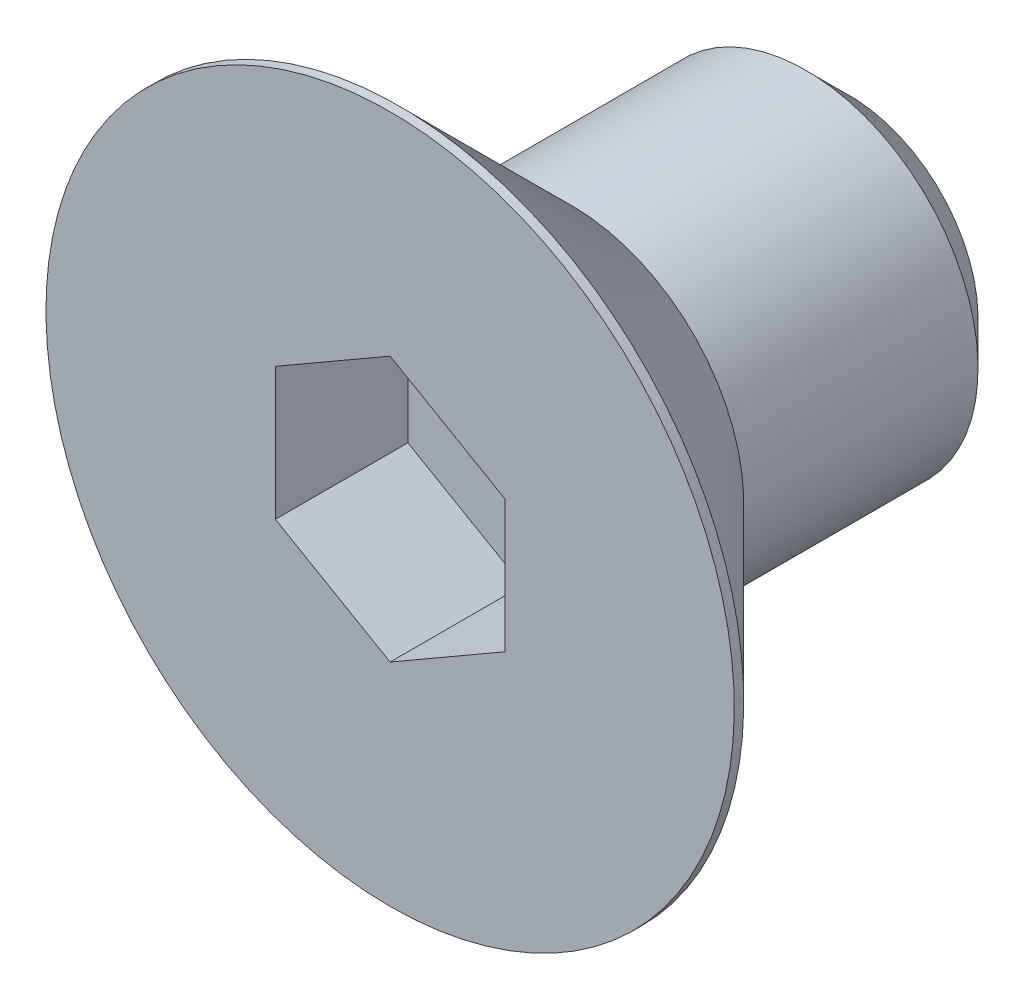
ISO-10303-21;
HEADER;
FILE_DESCRIPTION(('STEP AP214'),'2;1');
FILE_NAME('part.step','',(''),(''),'','','');
FILE_SCHEMA(('AUTOMOTIVE_DESIGN { 1 0 10303 214 1 1 1 1 }'));
ENDSEC;
DATA;
#1=APPLICATION_CONTEXT('core data for automotive mechanical design processes');
#2=APPLICATION_PROTOCOL_DEFINITION('international standard','automotive_design',2000,#1);
#3=PRODUCT_CONTEXT('',#1,'mechanical');
#4=PRODUCT('Part','Part','',(#3));
#5=PRODUCT_RELATED_PRODUCT_CATEGORY('part','',(#4));
#6=PRODUCT_DEFINITION_FORMATION('','',#4);
#7=PRODUCT_DEFINITION_CONTEXT('part definition',#1,'design');
#8=PRODUCT_DEFINITION('design','',#6,#7);
#9=PRODUCT_DEFINITION_SHAPE('','',#8);
#10=(LENGTH_UNIT() NAMED_UNIT(*) SI_UNIT(.MILLI.,.METRE.));
#11=(NAMED_UNIT(*) PLANE_ANGLE_UNIT() SI_UNIT($,.RADIAN.));
#12=(NAMED_UNIT(*) SI_UNIT($,.STERADIAN.) SOLID_ANGLE_UNIT());
#13=UNCERTAINTY_MEASURE_WITH_UNIT(LENGTH_MEASURE(1.E-05),#10,'distance_accuracy_value','');
#14=(GEOMETRIC_REPRESENTATION_CONTEXT(3) GLOBAL_UNCERTAINTY_ASSIGNED_CONTEXT((#13)) GLOBAL_UNIT_ASSIGNED_CONTEXT((#10,
#11,#12)) REPRESENTATION_CONTEXT('',''));
#15=CARTESIAN_POINT('',(0.,0.,0.));
#16=DIRECTION('',(0.,0.,1.));
#17=DIRECTION('',(1.,0.,0.));
#18=AXIS2_PLACEMENT_3D('',#15,#16,#17);
#19=CARTESIAN_POINT('',(0.,0.,3.83500000000001));
#20=DIRECTION('',(0.,0.,1.));
#21=DIRECTION('',(0.,-1.,0.));
#22=AXIS2_PLACEMENT_3D('',#19,#20,#21);
#23=CONICAL_SURFACE('',#22,6.,0.785398163397448);
#24=CARTESIAN_POINT('',(0.,0.,0.700000000000006));
#25=DIRECTION('',(0.,0.,1.));
#26=DIRECTION('',(0.,-1.,0.));
#27=AXIS2_PLACEMENT_3D('',#24,#25,#26);
#28=CIRCLE('',#27,2.865);
#29=CARTESIAN_POINT('',(0.,-2.865,0.700000000000006));
#30=VERTEX_POINT('',#29);
#31=EDGE_CURVE('E163',#30,#30,#28,.T.);
#32=ORIENTED_EDGE('',*,*,#31,.T.);
#33=EDGE_LOOP('',(#32));
#34=FACE_BOUND('',#33,.T.);
#35=CARTESIAN_POINT('',(0.,0.,3.83500000000001));
#36=DIRECTION('',(0.,0.,1.));
#37=DIRECTION('',(0.,-1.,0.));
#38=AXIS2_PLACEMENT_3D('',#35,#36,#37);
#39=CIRCLE('',#38,6.);
#40=CARTESIAN_POINT('',(0.,-6.,3.83500000000001));
#41=VERTEX_POINT('',#40);
#42=EDGE_CURVE('E12',#41,#41,#39,.T.);
#43=ORIENTED_EDGE('',*,*,#42,.F.);
#44=EDGE_LOOP('',(#43));
#45=FACE_BOUND('',#44,.T.);
#46=ADVANCED_FACE('F49',(#34,#45),#23,.T.);
#47=CARTESIAN_POINT('',(0.,0.,4.));
#48=DIRECTION('',(0.,0.,1.));
#49=DIRECTION('',(0.,-1.,0.));
#50=AXIS2_PLACEMENT_3D('',#47,#48,#49);
#51=CYLINDRICAL_SURFACE('',#50,6.);
#52=ORIENTED_EDGE('',*,*,#42,.T.);
#53=EDGE_LOOP('',(#52));
#54=FACE_BOUND('',#53,.T.);
#55=CARTESIAN_POINT('',(0.,0.,4.));
#56=DIRECTION('',(0.,0.,1.));
#57=DIRECTION('',(0.,-1.,0.));
#58=AXIS2_PLACEMENT_3D('',#55,#56,#57);
#59=CIRCLE('',#58,6.);
#60=CARTESIAN_POINT('',(0.,-6.,4.));
#61=VERTEX_POINT('',#60);
#62=EDGE_CURVE('E57',#61,#61,#59,.T.);
#63=ORIENTED_EDGE('',*,*,#62,.F.);
#64=EDGE_LOOP('',(#63));
#65=FACE_BOUND('',#64,.T.);
#66=ADVANCED_FACE('F181',(#54,#65),#51,.T.);
#67=CARTESIAN_POINT('',(0.,0.,4.));
#68=DIRECTION('',(0.,0.,-1.));
#69=DIRECTION('',(0.,1.,0.));
#70=AXIS2_PLACEMENT_3D('',#67,#68,#69);
#71=PLANE('',#70);
#72=DIRECTION('',(0.,1.,0.));
#73=VECTOR('',#72,1.);
#74=CARTESIAN_POINT('',(2.,-1.15470053837925,4.));
#75=LINE('',#74,#73);
#76=CARTESIAN_POINT('',(2.,-1.15470053837925,4.));
#77=VERTEX_POINT('',#76);
#78=CARTESIAN_POINT('',(2.,1.15470053837925,4.));
#79=VERTEX_POINT('',#78);
#80=EDGE_CURVE('E144',#77,#79,#75,.T.);
#81=ORIENTED_EDGE('',*,*,#80,.F.);
#82=DIRECTION('',(0.866025403784438,0.500000000000001,0.));
#83=VECTOR('',#82,1.);
#84=CARTESIAN_POINT('',(0.,-2.3094010767585,4.));
#85=LINE('',#84,#83);
#86=CARTESIAN_POINT('',(0.,-2.3094010767585,4.));
#87=VERTEX_POINT('',#86);
#88=EDGE_CURVE('E64',#87,#77,#85,.T.);
#89=ORIENTED_EDGE('',*,*,#88,.F.);
#90=DIRECTION('',(0.866025403784438,-0.5,0.));
#91=VECTOR('',#90,1.);
#92=CARTESIAN_POINT('',(-1.99999999999999,-1.15470053837925,4.));
#93=LINE('',#92,#91);
#94=CARTESIAN_POINT('',(-1.99999999999999,-1.15470053837925,4.));
#95=VERTEX_POINT('',#94);
#96=EDGE_CURVE('E157',#95,#87,#93,.T.);
#97=ORIENTED_EDGE('',*,*,#96,.F.);
#98=DIRECTION('',(0.,-1.,0.));
#99=VECTOR('',#98,1.);
#100=CARTESIAN_POINT('',(-1.99999999999999,1.15470053837925,4.));
#101=LINE('',#100,#99);
#102=CARTESIAN_POINT('',(-1.99999999999999,1.15470053837925,4.));
#103=VERTEX_POINT('',#102);
#104=EDGE_CURVE('E154',#103,#95,#101,.T.);
#105=ORIENTED_EDGE('',*,*,#104,.F.);
#106=DIRECTION('',(-0.866025403784439,-0.5,0.));
#107=VECTOR('',#106,1.);
#108=CARTESIAN_POINT('',(0.,2.3094010767585,4.));
#109=LINE('',#108,#107);
#110=CARTESIAN_POINT('',(0.,2.3094010767585,4.));
#111=VERTEX_POINT('',#110);
#112=EDGE_CURVE('E112',#111,#103,#109,.T.);
#113=ORIENTED_EDGE('',*,*,#112,.F.);
#114=DIRECTION('',(-0.866025403784439,0.5,0.));
#115=VECTOR('',#114,1.);
#116=CARTESIAN_POINT('',(2.,1.15470053837925,4.));
#117=LINE('',#116,#115);
#118=EDGE_CURVE('E148',#79,#111,#117,.T.);
#119=ORIENTED_EDGE('',*,*,#118,.F.);
#120=EDGE_LOOP('',(#81,#89,#97,#105,#113,#119));
#121=FACE_BOUND('',#120,.T.);
#122=ORIENTED_EDGE('',*,*,#62,.T.);
#123=EDGE_LOOP('',(#122));
#124=FACE_BOUND('',#123,.T.);
#125=ADVANCED_FACE('F179',(#121,#124),#71,.F.);
#126=CARTESIAN_POINT('',(0.,0.,0.700000000000006));
#127=DIRECTION('',(0.,0.,-1.));
#128=DIRECTION('',(0.,1.,0.));
#129=AXIS2_PLACEMENT_3D('',#126,#127,#128);
#130=PLANE('',#129);
#131=ORIENTED_EDGE('',*,*,#31,.F.);
#132=EDGE_LOOP('',(#131));
#133=FACE_BOUND('',#132,.T.);
#134=ADVANCED_FACE('F188',(#133),#130,.T.);
#135=CARTESIAN_POINT('',(0.,-2.3094010767585,1.69));
#136=DIRECTION('',(0.500000000000001,-0.866025403784438,0.));
#137=DIRECTION('',(0.866025403784438,0.500000000000001,0.));
#138=AXIS2_PLACEMENT_3D('',#135,#136,#137);
#139=PLANE('',#138);
#140=ORIENTED_EDGE('',*,*,#88,.T.);
#141=DIRECTION('',(0.,0.,1.));
#142=VECTOR('',#141,1.);
#143=CARTESIAN_POINT('',(2.,-1.15470053837925,1.69));
#144=LINE('',#143,#142);
#145=CARTESIAN_POINT('',(2.,-1.15470053837925,1.69));
#146=VERTEX_POINT('',#145);
#147=EDGE_CURVE('E94',#146,#77,#144,.T.);
#148=ORIENTED_EDGE('',*,*,#147,.F.);
#149=DIRECTION('',(0.866025403784438,0.500000000000001,0.));
#150=VECTOR('',#149,1.);
#151=CARTESIAN_POINT('',(0.,-2.3094010767585,1.69));
#152=LINE('',#151,#150);
#153=CARTESIAN_POINT('',(0.,-2.3094010767585,1.69));
#154=VERTEX_POINT('',#153);
#155=EDGE_CURVE('E160',#154,#146,#152,.T.);
#156=ORIENTED_EDGE('',*,*,#155,.F.);
#157=DIRECTION('',(0.,0.,1.));
#158=VECTOR('',#157,1.);
#159=CARTESIAN_POINT('',(0.,-2.3094010767585,1.69));
#160=LINE('',#159,#158);
#161=EDGE_CURVE('E72',#154,#87,#160,.T.);
#162=ORIENTED_EDGE('',*,*,#161,.T.);
#163=EDGE_LOOP('',(#140,#148,#156,#162));
#164=FACE_BOUND('',#163,.T.);
#165=ADVANCED_FACE('F195',(#164),#139,.F.);
#166=CARTESIAN_POINT('',(-1.99999999999999,-1.15470053837925,1.69));
#167=DIRECTION('',(-0.5,-0.866025403784439,0.));
#168=DIRECTION('',(0.866025403784439,-0.5,0.));
#169=AXIS2_PLACEMENT_3D('',#166,#167,#168);
#170=PLANE('',#169);
#171=ORIENTED_EDGE('',*,*,#96,.T.);
#172=ORIENTED_EDGE('',*,*,#161,.F.);
#173=DIRECTION('',(0.866025403784438,-0.5,0.));
#174=VECTOR('',#173,1.);
#175=CARTESIAN_POINT('',(-1.99999999999999,-1.15470053837925,1.69));
#176=LINE('',#175,#174);
#177=CARTESIAN_POINT('',(-1.99999999999999,-1.15470053837925,1.69));
#178=VERTEX_POINT('',#177);
#179=EDGE_CURVE('E126',#178,#154,#176,.T.);
#180=ORIENTED_EDGE('',*,*,#179,.F.);
#181=DIRECTION('',(0.,0.,1.));
#182=VECTOR('',#181,1.);
#183=CARTESIAN_POINT('',(-1.99999999999999,-1.15470053837925,1.69));
#184=LINE('',#183,#182);
#185=EDGE_CURVE('E117',#178,#95,#184,.T.);
#186=ORIENTED_EDGE('',*,*,#185,.T.);
#187=EDGE_LOOP('',(#171,#172,#180,#186));
#188=FACE_BOUND('',#187,.T.);
#189=ADVANCED_FACE('F199',(#188),#170,.F.);
#190=CARTESIAN_POINT('',(-1.99999999999999,1.15470053837925,1.69));
#191=DIRECTION('',(-1.,0.,0.));
#192=DIRECTION('',(0.,-1.,0.));
#193=AXIS2_PLACEMENT_3D('',#190,#191,#192);
#194=PLANE('',#193);
#195=ORIENTED_EDGE('',*,*,#104,.T.);
#196=ORIENTED_EDGE('',*,*,#185,.F.);
#197=DIRECTION('',(0.,-1.,0.));
#198=VECTOR('',#197,1.);
#199=CARTESIAN_POINT('',(-1.99999999999999,1.15470053837925,1.69));
#200=LINE('',#199,#198);
#201=CARTESIAN_POINT('',(-1.99999999999999,1.15470053837925,1.69));
#202=VERTEX_POINT('',#201);
#203=EDGE_CURVE('E121',#202,#178,#200,.T.);
#204=ORIENTED_EDGE('',*,*,#203,.F.);
#205=DIRECTION('',(0.,0.,1.));
#206=VECTOR('',#205,1.);
#207=CARTESIAN_POINT('',(-1.99999999999999,1.15470053837925,1.69));
#208=LINE('',#207,#206);
#209=EDGE_CURVE('E105',#202,#103,#208,.T.);
#210=ORIENTED_EDGE('',*,*,#209,.T.);
#211=EDGE_LOOP('',(#195,#196,#204,#210));
#212=FACE_BOUND('',#211,.T.);
#213=ADVANCED_FACE('F122',(#212),#194,.F.);
#214=CARTESIAN_POINT('',(0.,2.3094010767585,1.69));
#215=DIRECTION('',(-0.5,0.866025403784439,0.));
#216=DIRECTION('',(-0.866025403784439,-0.5,0.));
#217=AXIS2_PLACEMENT_3D('',#214,#215,#216);
#218=PLANE('',#217);
#219=ORIENTED_EDGE('',*,*,#112,.T.);
#220=ORIENTED_EDGE('',*,*,#209,.F.);
#221=DIRECTION('',(-0.866025403784439,-0.5,0.));
#222=VECTOR('',#221,1.);
#223=CARTESIAN_POINT('',(0.,2.3094010767585,1.69));
#224=LINE('',#223,#222);
#225=CARTESIAN_POINT('',(0.,2.3094010767585,1.69));
#226=VERTEX_POINT('',#225);
#227=EDGE_CURVE('E109',#226,#202,#224,.T.);
#228=ORIENTED_EDGE('',*,*,#227,.F.);
#229=DIRECTION('',(0.,0.,1.));
#230=VECTOR('',#229,1.);
#231=CARTESIAN_POINT('',(0.,2.3094010767585,1.69));
#232=LINE('',#231,#230);
#233=EDGE_CURVE('E118',#226,#111,#232,.T.);
#234=ORIENTED_EDGE('',*,*,#233,.T.);
#235=EDGE_LOOP('',(#219,#220,#228,#234));
#236=FACE_BOUND('',#235,.T.);
#237=ADVANCED_FACE('F107',(#236),#218,.F.);
#238=CARTESIAN_POINT('',(2.,1.15470053837925,1.69));
#239=DIRECTION('',(0.5,0.866025403784439,0.));
#240=DIRECTION('',(-0.866025403784439,0.5,0.));
#241=AXIS2_PLACEMENT_3D('',#238,#239,#240);
#242=PLANE('',#241);
#243=ORIENTED_EDGE('',*,*,#118,.T.);
#244=ORIENTED_EDGE('',*,*,#233,.F.);
#245=DIRECTION('',(-0.866025403784439,0.5,0.));
#246=VECTOR('',#245,1.);
#247=CARTESIAN_POINT('',(2.,1.15470053837925,1.69));
#248=LINE('',#247,#246);
#249=CARTESIAN_POINT('',(2.,1.15470053837925,1.69));
#250=VERTEX_POINT('',#249);
#251=EDGE_CURVE('E132',#250,#226,#248,.T.);
#252=ORIENTED_EDGE('',*,*,#251,.F.);
#253=DIRECTION('',(0.,0.,1.));
#254=VECTOR('',#253,1.);
#255=CARTESIAN_POINT('',(2.,1.15470053837925,1.69));
#256=LINE('',#255,#254);
#257=EDGE_CURVE('E168',#250,#79,#256,.T.);
#258=ORIENTED_EDGE('',*,*,#257,.T.);
#259=EDGE_LOOP('',(#243,#244,#252,#258));
#260=FACE_BOUND('',#259,.T.);
#261=ADVANCED_FACE('F203',(#260),#242,.F.);
#262=CARTESIAN_POINT('',(2.,-1.15470053837925,1.69));
#263=DIRECTION('',(1.,0.,0.));
#264=DIRECTION('',(0.,0.,-1.));
#265=AXIS2_PLACEMENT_3D('',#262,#263,#264);
#266=PLANE('',#265);
#267=ORIENTED_EDGE('',*,*,#80,.T.);
#268=ORIENTED_EDGE('',*,*,#257,.F.);
#269=DIRECTION('',(0.,1.,0.));
#270=VECTOR('',#269,1.);
#271=CARTESIAN_POINT('',(2.,-1.15470053837925,1.69));
#272=LINE('',#271,#270);
#273=EDGE_CURVE('E136',#146,#250,#272,.T.);
#274=ORIENTED_EDGE('',*,*,#273,.F.);
#275=ORIENTED_EDGE('',*,*,#147,.T.);
#276=EDGE_LOOP('',(#267,#268,#274,#275));
#277=FACE_BOUND('',#276,.T.);
#278=ADVANCED_FACE('F200',(#277),#266,.F.);
#279=CARTESIAN_POINT('',(2.,-1.15470053837924,1.69));
#280=DIRECTION('',(0.,0.,1.));
#281=DIRECTION('',(1.,0.,0.));
#282=AXIS2_PLACEMENT_3D('',#279,#280,#281);
#283=PLANE('',#282);
#284=ORIENTED_EDGE('',*,*,#155,.T.);
#285=ORIENTED_EDGE('',*,*,#273,.T.);
#286=ORIENTED_EDGE('',*,*,#251,.T.);
#287=ORIENTED_EDGE('',*,*,#227,.T.);
#288=ORIENTED_EDGE('',*,*,#203,.T.);
#289=ORIENTED_EDGE('',*,*,#179,.T.);
#290=EDGE_LOOP('',(#284,#285,#286,#287,#288,#289));
#291=FACE_BOUND('',#290,.T.);
#292=ADVANCED_FACE('F129',(#291),#283,.T.);
#293=CLOSED_SHELL('',(#46,#66,#125,#134,#165,#189,#213,#237,#261,#278,#292));
#294=MANIFOLD_SOLID_BREP('B2',#293);
#295=CARTESIAN_POINT('',(0.,-3.00000000000001,1.69));
#296=DIRECTION('',(0.,0.,-1.));
#297=DIRECTION('',(0.,1.,0.));
#298=AXIS2_PLACEMENT_3D('',#295,#296,#297);
#299=PLANE('',#298);
#300=CARTESIAN_POINT('',(0.,0.,1.69));
#301=DIRECTION('',(0.,0.,1.));
#302=DIRECTION('',(0.,-1.,0.));
#303=AXIS2_PLACEMENT_3D('',#300,#301,#302);
#304=CIRCLE('',#303,3.00000000000001);
#305=CARTESIAN_POINT('',(0.,-3.00000000000001,1.69));
#306=VERTEX_POINT('',#305);
#307=EDGE_CURVE('E302',#306,#306,#304,.T.);
#308=ORIENTED_EDGE('',*,*,#307,.T.);
#309=EDGE_LOOP('',(#308));
#310=FACE_BOUND('',#309,.T.);
#311=ADVANCED_FACE('F291',(#310),#299,.F.);
#312=CARTESIAN_POINT('',(0.,-3.,-4.00000000000001));
#313=DIRECTION('',(0.,0.,1.));
#314=DIRECTION('',(0.,-1.,0.));
#315=AXIS2_PLACEMENT_3D('',#312,#313,#314);
#316=PLANE('',#315);
#317=CARTESIAN_POINT('',(0.,0.,-4.00000000000001));
#318=DIRECTION('',(0.,0.,1.));
#319=DIRECTION('',(0.,-1.,0.));
#320=AXIS2_PLACEMENT_3D('',#317,#318,#319);
#321=CIRCLE('',#320,2.25);
#322=CARTESIAN_POINT('',(0.,-2.25,-4.00000000000001));
#323=VERTEX_POINT('',#322);
#324=EDGE_CURVE('E48',#323,#323,#321,.F.);
#325=ORIENTED_EDGE('',*,*,#324,.T.);
#326=EDGE_LOOP('',(#325));
#327=FACE_BOUND('',#326,.T.);
#328=ADVANCED_FACE('F312',(#327),#316,.F.);
#329=CARTESIAN_POINT('',(0.,0.,1.69));
#330=DIRECTION('',(0.,0.,1.));
#331=DIRECTION('',(0.,-1.,0.));
#332=AXIS2_PLACEMENT_3D('',#329,#330,#331);
#333=CYLINDRICAL_SURFACE('',#332,3.00000000000001);
#334=CARTESIAN_POINT('',(0.,0.,-3.25));
#335=DIRECTION('',(0.,0.,1.));
#336=DIRECTION('',(0.,-1.,0.));
#337=AXIS2_PLACEMENT_3D('',#334,#335,#336);
#338=CIRCLE('',#337,3.00000000000001);
#339=CARTESIAN_POINT('',(0.,-3.00000000000001,-3.25));
#340=VERTEX_POINT('',#339);
#341=EDGE_CURVE('E298',#340,#340,#338,.T.);
#342=ORIENTED_EDGE('',*,*,#341,.T.);
#343=EDGE_LOOP('',(#342));
#344=FACE_BOUND('',#343,.T.);
#345=ORIENTED_EDGE('',*,*,#307,.F.);
#346=EDGE_LOOP('',(#345));
#347=FACE_BOUND('',#346,.T.);
#348=ADVANCED_FACE('F310',(#344,#347),#333,.T.);
#349=CARTESIAN_POINT('',(0.,0.,-3.25));
#350=DIRECTION('',(0.,0.,1.));
#351=DIRECTION('',(0.,-1.,0.));
#352=AXIS2_PLACEMENT_3D('',#349,#350,#351);
#353=CONICAL_SURFACE('',#352,3.00000000000001,0.78539816339745);
#354=ORIENTED_EDGE('',*,*,#324,.F.);
#355=EDGE_LOOP('',(#354));
#356=FACE_BOUND('',#355,.T.);
#357=ORIENTED_EDGE('',*,*,#341,.F.);
#358=EDGE_LOOP('',(#357));
#359=FACE_BOUND('',#358,.T.);
#360=ADVANCED_FACE('F293',(#356,#359),#353,.T.);
#361=CLOSED_SHELL('',(#311,#328,#348,#360));
#362=MANIFOLD_SOLID_BREP('B6',#361);
#363=ADVANCED_BREP_SHAPE_REPRESENTATION('',(#18,#294,#362),#14);
#364=SHAPE_DEFINITION_REPRESENTATION(#9,#363);
ENDSEC;
END-ISO-10303-21;
